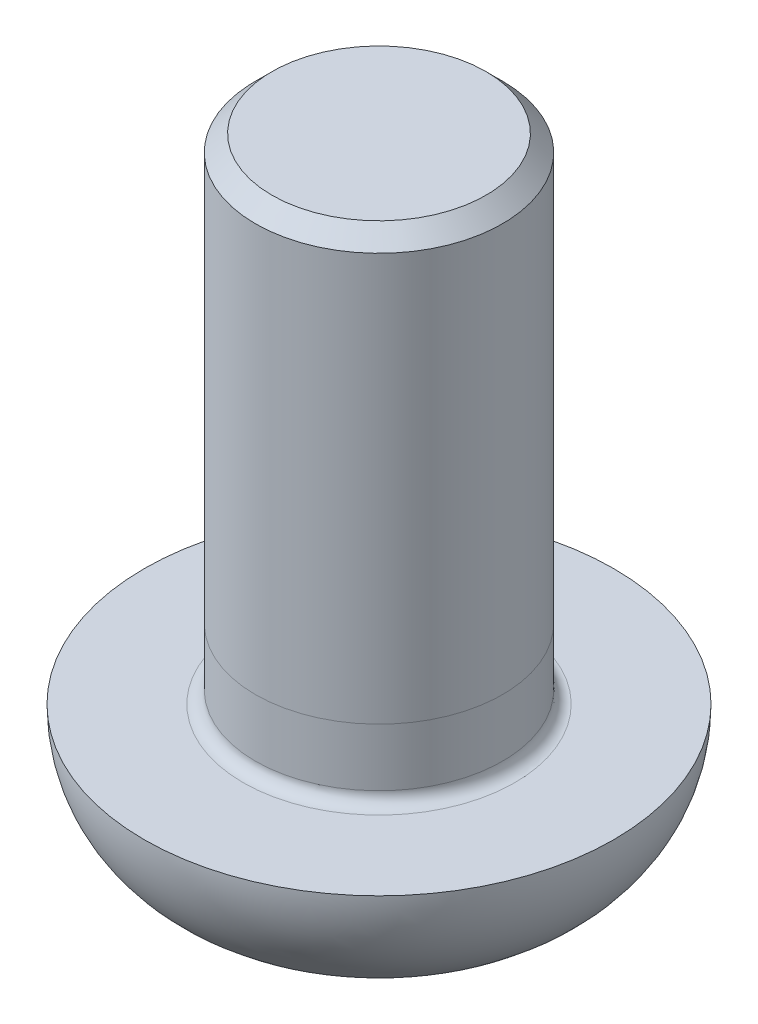
ISO-10303-21;
HEADER;
FILE_DESCRIPTION(('STEP AP214'),'2;1');
FILE_NAME('part.step','',(''),(''),'','','');
FILE_SCHEMA(('AUTOMOTIVE_DESIGN { 1 0 10303 214 1 1 1 1 }'));
ENDSEC;
DATA;
#1=APPLICATION_CONTEXT('core data for automotive mechanical design processes');
#2=APPLICATION_PROTOCOL_DEFINITION('international standard','automotive_design',2000,#1);
#3=PRODUCT_CONTEXT('',#1,'mechanical');
#4=PRODUCT('Part','Part','',(#3));
#5=PRODUCT_RELATED_PRODUCT_CATEGORY('part','',(#4));
#6=PRODUCT_DEFINITION_FORMATION('','',#4);
#7=PRODUCT_DEFINITION_CONTEXT('part definition',#1,'design');
#8=PRODUCT_DEFINITION('design','',#6,#7);
#9=PRODUCT_DEFINITION_SHAPE('','',#8);
#10=(LENGTH_UNIT() NAMED_UNIT(*) SI_UNIT(.MILLI.,.METRE.));
#11=(NAMED_UNIT(*) PLANE_ANGLE_UNIT() SI_UNIT($,.RADIAN.));
#12=(NAMED_UNIT(*) SI_UNIT($,.STERADIAN.) SOLID_ANGLE_UNIT());
#13=UNCERTAINTY_MEASURE_WITH_UNIT(LENGTH_MEASURE(1.E-05),#10,'distance_accuracy_value','');
#14=(GEOMETRIC_REPRESENTATION_CONTEXT(3) GLOBAL_UNCERTAINTY_ASSIGNED_CONTEXT((#13)) GLOBAL_UNIT_ASSIGNED_CONTEXT((#10,
#11,#12)) REPRESENTATION_CONTEXT('',''));
#15=CARTESIAN_POINT('',(0.,0.,0.));
#16=DIRECTION('',(0.,0.,1.));
#17=DIRECTION('',(1.,0.,0.));
#18=AXIS2_PLACEMENT_3D('',#15,#16,#17);
#19=CARTESIAN_POINT('',(0.,0.,0.));
#20=DIRECTION('',(0.,1.,0.));
#21=DIRECTION('',(0.,0.,1.));
#22=AXIS2_PLACEMENT_3D('',#19,#20,#21);
#23=CYLINDRICAL_SURFACE('',#22,2.);
#24=CARTESIAN_POINT('',(0.,7.73333333333333,0.));
#25=DIRECTION('',(0.,1.,0.));
#26=DIRECTION('',(0.,0.,1.));
#27=AXIS2_PLACEMENT_3D('',#24,#25,#26);
#28=CIRCLE('',#27,2.);
#29=CARTESIAN_POINT('',(0.,7.73333333333333,2.));
#30=VERTEX_POINT('',#29);
#31=EDGE_CURVE('E28',#30,#30,#28,.F.);
#32=ORIENTED_EDGE('',*,*,#31,.T.);
#33=EDGE_LOOP('',(#32));
#34=FACE_BOUND('',#33,.T.);
#35=CARTESIAN_POINT('',(0.,1.13333333333333,0.));
#36=DIRECTION('',(0.,1.,0.));
#37=DIRECTION('',(0.,0.,1.));
#38=AXIS2_PLACEMENT_3D('',#35,#36,#37);
#39=CIRCLE('',#38,2.);
#40=CARTESIAN_POINT('',(0.,1.13333333333333,2.));
#41=VERTEX_POINT('',#40);
#42=EDGE_CURVE('E11',#41,#41,#39,.T.);
#43=ORIENTED_EDGE('',*,*,#42,.T.);
#44=EDGE_LOOP('',(#43));
#45=FACE_BOUND('',#44,.T.);
#46=ADVANCED_FACE('F18',(#34,#45),#23,.T.);
#47=ORIENTED_EDGE('',*,*,#42,.F.);
#48=EDGE_LOOP('',(#47));
#49=FACE_BOUND('',#48,.T.);
#50=CARTESIAN_POINT('',(0.,0.2,0.));
#51=DIRECTION('',(0.,1.,0.));
#52=DIRECTION('',(0.,0.,1.));
#53=AXIS2_PLACEMENT_3D('',#50,#51,#52);
#54=CIRCLE('',#53,2.);
#55=CARTESIAN_POINT('',(0.,0.2,2.));
#56=VERTEX_POINT('',#55);
#57=EDGE_CURVE('E280',#56,#56,#54,.T.);
#58=ORIENTED_EDGE('',*,*,#57,.T.);
#59=EDGE_LOOP('',(#58));
#60=FACE_BOUND('',#59,.T.);
#61=ADVANCED_FACE('F192',(#49,#60),#23,.T.);
#62=CARTESIAN_POINT('',(3.8,0.,0.));
#63=DIRECTION('',(0.,1.,0.));
#64=DIRECTION('',(0.,0.,1.));
#65=AXIS2_PLACEMENT_3D('',#62,#63,#64);
#66=PLANE('',#65);
#67=CARTESIAN_POINT('',(0.,0.,0.));
#68=DIRECTION('',(0.,1.,0.));
#69=DIRECTION('',(0.,0.,1.));
#70=AXIS2_PLACEMENT_3D('',#67,#68,#69);
#71=CIRCLE('',#70,2.2);
#72=CARTESIAN_POINT('',(0.,0.,2.2));
#73=VERTEX_POINT('',#72);
#74=EDGE_CURVE('E277',#73,#73,#71,.F.);
#75=ORIENTED_EDGE('',*,*,#74,.T.);
#76=EDGE_LOOP('',(#75));
#77=FACE_BOUND('',#76,.T.);
#78=CARTESIAN_POINT('',(0.,0.,0.));
#79=DIRECTION('',(0.,1.,0.));
#80=DIRECTION('',(0.,0.,1.));
#81=AXIS2_PLACEMENT_3D('',#78,#79,#80);
#82=CIRCLE('',#81,3.8);
#83=CARTESIAN_POINT('',(0.,0.,3.8));
#84=VERTEX_POINT('',#83);
#85=EDGE_CURVE('E108',#84,#84,#82,.T.);
#86=ORIENTED_EDGE('',*,*,#85,.T.);
#87=EDGE_LOOP('',(#86));
#88=FACE_BOUND('',#87,.T.);
#89=ADVANCED_FACE('F199',(#77,#88),#66,.T.);
#90=CARTESIAN_POINT('',(0.,8.,0.));
#91=DIRECTION('',(0.,1.,0.));
#92=DIRECTION('',(0.,0.,1.));
#93=AXIS2_PLACEMENT_3D('',#90,#91,#92);
#94=PLANE('',#93);
#95=CARTESIAN_POINT('',(0.,8.,0.));
#96=DIRECTION('',(0.,1.,0.));
#97=DIRECTION('',(0.,0.,1.));
#98=AXIS2_PLACEMENT_3D('',#95,#96,#97);
#99=CIRCLE('',#98,1.73333333333333);
#100=CARTESIAN_POINT('',(0.,8.,1.73333333333333));
#101=VERTEX_POINT('',#100);
#102=EDGE_CURVE('E282',#101,#101,#99,.T.);
#103=ORIENTED_EDGE('',*,*,#102,.T.);
#104=EDGE_LOOP('',(#103));
#105=FACE_BOUND('',#104,.T.);
#106=ADVANCED_FACE('F227',(#105),#94,.T.);
#107=CARTESIAN_POINT('',(0.,0.2,0.));
#108=DIRECTION('',(0.,1.,0.));
#109=DIRECTION('',(0.,0.,1.));
#110=AXIS2_PLACEMENT_3D('',#107,#108,#109);
#111=TOROIDAL_SURFACE('',#110,2.2,0.2);
#112=ORIENTED_EDGE('',*,*,#74,.F.);
#113=EDGE_LOOP('',(#112));
#114=FACE_BOUND('',#113,.T.);
#115=ORIENTED_EDGE('',*,*,#57,.F.);
#116=EDGE_LOOP('',(#115));
#117=FACE_BOUND('',#116,.T.);
#118=ADVANCED_FACE('F265',(#114,#117),#111,.F.);
#119=CARTESIAN_POINT('',(0.,8.,0.));
#120=DIRECTION('',(0.,-1.,0.));
#121=DIRECTION('',(0.,0.,-1.));
#122=AXIS2_PLACEMENT_3D('',#119,#120,#121);
#123=CONICAL_SURFACE('',#122,1.73333333333333,0.785398163397448);
#124=ORIENTED_EDGE('',*,*,#31,.F.);
#125=EDGE_LOOP('',(#124));
#126=FACE_BOUND('',#125,.T.);
#127=ORIENTED_EDGE('',*,*,#102,.F.);
#128=EDGE_LOOP('',(#127));
#129=FACE_BOUND('',#128,.T.);
#130=ADVANCED_FACE('F21',(#126,#129),#123,.T.);
#131=CARTESIAN_POINT('',(0.,0.,0.));
#132=DIRECTION('',(0.,-1.,0.));
#133=DIRECTION('',(0.,0.,-1.));
#134=AXIS2_PLACEMENT_3D('',#131,#132,#133);
#135=DEGENERATE_TOROIDAL_SURFACE('',#134,1.57361997405967,2.22638002594034,.T.);
#136=ORIENTED_EDGE('',*,*,#85,.F.);
#137=EDGE_LOOP('',(#136));
#138=FACE_BOUND('',#137,.T.);
#139=CARTESIAN_POINT('',(0.,-2.2,0.));
#140=DIRECTION('',(0.,-1.,0.));
#141=DIRECTION('',(0.,0.,-1.));
#142=AXIS2_PLACEMENT_3D('',#139,#140,#141);
#143=CIRCLE('',#142,1.91533333333333);
#144=CARTESIAN_POINT('',(0.,-2.2,-1.91533333333333));
#145=VERTEX_POINT('',#144);
#146=EDGE_CURVE('E119',#145,#145,#143,.T.);
#147=ORIENTED_EDGE('',*,*,#146,.F.);
#148=EDGE_LOOP('',(#147));
#149=FACE_BOUND('',#148,.T.);
#150=ADVANCED_FACE('F143',(#138,#149),#135,.T.);
#151=CARTESIAN_POINT('',(0.,0.218038796285712,0.));
#152=DIRECTION('',(0.,-1.,0.));
#153=DIRECTION('',(0.,0.,-1.));
#154=AXIS2_PLACEMENT_3D('',#151,#152,#153);
#155=CONICAL_SURFACE('',#154,0.,1.0471975511966);
#156=CARTESIAN_POINT('',(0.,0.218038796285712,0.));
#157=VERTEX_POINT('',#156);
#158=VERTEX_LOOP('',#157);
#159=FACE_BOUND('',#158,.T.);
#160=CARTESIAN_POINT('',(-0.721572366433197,-0.61536121171365,1.2502));
#161=CARTESIAN_POINT('',(-0.753288124996233,-0.597040451811313,1.19526669476823));
#162=CARTESIAN_POINT('',(-0.785277649221706,-0.58037784324826,1.13985921349976));
#163=CARTESIAN_POINT('',(-0.849810733708406,-0.551291840993392,1.02808463239966));
#164=CARTESIAN_POINT('',(-0.882355441401185,-0.538878739023672,0.971715545158289));
#165=CARTESIAN_POINT('',(-0.947041487997321,-0.519554224683634,0.859676025913014));
#166=CARTESIAN_POINT('',(-0.979172868975897,-0.512514226495054,0.804022841540769));
#167=CARTESIAN_POINT('',(-1.04358696985655,-0.504106969678256,0.692454346091606));
#168=CARTESIAN_POINT('',(-1.07586945532687,-0.502732752252347,0.636539441062396));
#169=CARTESIAN_POINT('',(-1.13620103554813,-0.505577874415543,0.532042078818271));
#170=CARTESIAN_POINT('',(-1.16425912049992,-0.509098635867638,0.483444050118682));
#171=CARTESIAN_POINT('',(-1.2201924752656,-0.520261649746878,0.386564637826761));
#172=CARTESIAN_POINT('',(-1.24806755133608,-0.5279077226203,0.338283589807836));
#173=CARTESIAN_POINT('',(-1.30411641158755,-0.547023991748154,0.241204116145956));
#174=CARTESIAN_POINT('',(-1.33228309485381,-0.55857529402728,0.1924179896481));
#175=CARTESIAN_POINT('',(-1.38819614400745,-0.584792851741514,0.095573747707898));
#176=CARTESIAN_POINT('',(-1.41594322730596,-0.599452939186728,0.0475143896730359));
#177=CARTESIAN_POINT('',(-1.4434911430279,-0.615361211713649,-0.000200000000000275));
#178=B_SPLINE_CURVE_WITH_KNOTS('',3,(#160,#161,#162,#163,#164,#165,#166,#167,#168,#169,#170,
#171,#172,#173,#174,#175,#176,#177),.UNSPECIFIED.,.F.,.F.,(4,2,2,2,2,2,2,2,4),(0.,
0.19815082102956,0.396778196315222,0.590488617354402,0.783961049317185,0.952480056398648,
1.1211553973001,1.2935743034359,1.4656542697693),.UNSPECIFIED.);
#179=CARTESIAN_POINT('',(-0.721687836487035,-0.615294537047623,1.25));
#180=VERTEX_POINT('',#179);
#181=CARTESIAN_POINT('',(-1.44337567297406,-0.615294537047622,0.));
#182=VERTEX_POINT('',#181);
#183=EDGE_CURVE('E231',#180,#182,#178,.T.);
#184=ORIENTED_EDGE('',*,*,#183,.T.);
#185=CARTESIAN_POINT('',(-1.4434911430279,-0.615361211713649,0.000199999999999764));
#186=CARTESIAN_POINT('',(-1.41177538446487,-0.597040451811311,-0.0547333052317656));
#187=CARTESIAN_POINT('',(-1.37978586023939,-0.580377843248258,-0.11014078650024));
#188=CARTESIAN_POINT('',(-1.31525277575269,-0.55129184099339,-0.221915367600341));
#189=CARTESIAN_POINT('',(-1.28270806805991,-0.53887873902367,-0.278284454841711));
#190=CARTESIAN_POINT('',(-1.21802202146378,-0.519554224683632,-0.390323974086985));
#191=CARTESIAN_POINT('',(-1.1858906404852,-0.512514226495052,-0.44597715845923));
#192=CARTESIAN_POINT('',(-1.12147653960455,-0.504106969678254,-0.557545653908392));
#193=CARTESIAN_POINT('',(-1.08919405413422,-0.502732752252345,-0.6134605589376));
#194=CARTESIAN_POINT('',(-1.02886247391297,-0.505577874415541,-0.717957921181725));
#195=CARTESIAN_POINT('',(-1.00080438896118,-0.509098635867636,-0.766555949881316));
#196=CARTESIAN_POINT('',(-0.944871034195502,-0.520261649746876,-0.863435362173239));
#197=CARTESIAN_POINT('',(-0.916995958125019,-0.527907722620297,-0.911716410192164));
#198=CARTESIAN_POINT('',(-0.860947097873545,-0.547023991748152,-1.00879588385404));
#199=CARTESIAN_POINT('',(-0.832780414607288,-0.558575294027278,-1.0575820103519));
#200=CARTESIAN_POINT('',(-0.776867365453647,-0.584792851741513,-1.1544262522921));
#201=CARTESIAN_POINT('',(-0.749120282155139,-0.599452939186727,-1.20248561032696));
#202=CARTESIAN_POINT('',(-0.721572366433192,-0.615361211713649,-1.2502));
#203=B_SPLINE_CURVE_WITH_KNOTS('',3,(#185,#186,#187,#188,#189,#190,#191,#192,#193,#194,#195,
#196,#197,#198,#199,#200,#201,#202),.UNSPECIFIED.,.F.,.F.,(4,2,2,2,2,2,2,2,4),(0.,
0.19815082102956,0.396778196315221,0.5904886173544,0.783961049317182,0.952480056398646,
1.1211553973001,1.2935743034359,1.4656542697693),.UNSPECIFIED.);
#204=CARTESIAN_POINT('',(-0.72168783648703,-0.615294537047622,-1.25));
#205=VERTEX_POINT('',#204);
#206=EDGE_CURVE('E210',#182,#205,#203,.T.);
#207=ORIENTED_EDGE('',*,*,#206,.T.);
#208=CARTESIAN_POINT('',(-2.54763263884396,-1.42034781483543,-1.25));
#209=CARTESIAN_POINT('',(-2.48858814848979,-1.38974655627274,-1.25));
#210=CARTESIAN_POINT('',(-2.42946132380861,-1.35930325819372,-1.25));
#211=CARTESIAN_POINT('',(-2.31100621337497,-1.29880899854642,-1.25));
#212=CARTESIAN_POINT('',(-2.25167792439344,-1.26875804330437,-1.25));
#213=CARTESIAN_POINT('',(-2.07315573182142,-1.17921810874384,-1.25));
#214=CARTESIAN_POINT('',(-1.95360584248973,-1.120436634465,-1.25));
#215=CARTESIAN_POINT('',(-1.70660137514319,-1.00259349280083,-1.25));
#216=CARTESIAN_POINT('',(-1.57907012570324,-0.943690001440491,-1.25));
#217=CARTESIAN_POINT('',(-1.38607065799675,-0.859297157706683,-1.25));
#218=CARTESIAN_POINT('',(-1.32146942405589,-0.831832716991689,-1.25));
#219=CARTESIAN_POINT('',(-1.19155331450912,-0.778654559169664,-1.25));
#220=CARTESIAN_POINT('',(-1.12623850703849,-0.752940676577808,-1.25));
#221=CARTESIAN_POINT('',(-0.985406106106382,-0.700337108531101,-1.25));
#222=CARTESIAN_POINT('',(-0.909755708075264,-0.67379820711949,-1.25));
#223=CARTESIAN_POINT('',(-0.757125975582203,-0.62491472978331,-1.25));
#224=CARTESIAN_POINT('',(-0.680147301103551,-0.60256813282724,-1.25));
#225=CARTESIAN_POINT('',(-0.526245045804024,-0.563995858609741,-1.25));
#226=CARTESIAN_POINT('',(-0.449350335936646,-0.547658128160713,-1.25));
#227=CARTESIAN_POINT('',(-0.294381725409083,-0.522156855321589,-1.25));
#228=CARTESIAN_POINT('',(-0.216308559961843,-0.512989014208104,-1.25));
#229=CARTESIAN_POINT('',(-0.0583828758011715,-0.502995662912947,-1.25));
#230=CARTESIAN_POINT('',(0.0214784313803951,-0.502302121878524,-1.25));
#231=CARTESIAN_POINT('',(0.180791772460036,-0.509712504848663,-1.25));
#232=CARTESIAN_POINT('',(0.260243691894857,-0.517818767974262,-1.25));
#233=CARTESIAN_POINT('',(0.419601542701518,-0.541896181288127,-1.25));
#234=CARTESIAN_POINT('',(0.499482097120194,-0.558028587116615,-1.25));
#235=CARTESIAN_POINT('',(0.657747733098109,-0.596405359159968,-1.25));
#236=CARTESIAN_POINT('',(0.736132187697356,-0.618652230083401,-1.25));
#237=CARTESIAN_POINT('',(0.891742095151457,-0.667669145495548,-1.25));
#238=CARTESIAN_POINT('',(0.968962615121981,-0.694454533628736,-1.25));
#239=CARTESIAN_POINT('',(1.12222685935084,-0.751228876861405,-1.25));
#240=CARTESIAN_POINT('',(1.19827022427451,-0.781218788916174,-1.25));
#241=CARTESIAN_POINT('',(1.34949127522801,-0.843535866441461,-1.25));
#242=CARTESIAN_POINT('',(1.42466781555005,-0.87586578779028,-1.25));
#243=CARTESIAN_POINT('',(1.57427404296598,-0.942212209554762,-1.24999999999999));
#244=CARTESIAN_POINT('',(1.64870368385957,-0.976228813538264,-1.24999999999999));
#245=CARTESIAN_POINT('',(1.79249475511652,-1.04342426579454,-1.24999999999999));
#246=CARTESIAN_POINT('',(1.86189070514544,-1.07652955895538,-1.24999999999999));
#247=CARTESIAN_POINT('',(2.00026915039475,-1.14359808337372,-1.24999999999999));
#248=CARTESIAN_POINT('',(2.06925162955222,-1.17756134769862,-1.24999999999999));
#249=CARTESIAN_POINT('',(2.20662390252237,-1.24602954716207,-1.24999999999999));
#250=CARTESIAN_POINT('',(2.27501494862433,-1.2805319756901,-1.24999999999999));
#251=CARTESIAN_POINT('',(2.41151727555281,-1.35007073700256,-1.24999999999999));
#252=CARTESIAN_POINT('',(2.47962858177214,-1.38510701990394,-1.25));
#253=CARTESIAN_POINT('',(2.54763263884396,-1.42034781483543,-1.25));
#254=B_SPLINE_CURVE_WITH_KNOTS('',3,(#208,#209,#210,#211,#212,#213,#214,#215,#216,#217,#218,
#219,#220,#221,#222,#223,#224,#225,#226,#227,#228,#229,#230,#231,#232,#233,#234,#235,#236,#237,
#238,#239,#240,#241,#242,#243,#244,#245,#246,#247,#248,#249,#250,#251,#252,#253),.UNSPECIFIED.,
.F.,.F.,(4,2,2,2,2,2,2,2,2,2,2,2,2,2,2,2,2,2,2,2,2,2,4),(0.,0.199510194000779,0.399023600987611,
0.798663907516947,1.22000952232658,1.43058141360586,1.64113337125418,1.88155803417432,
2.12186649334229,2.35743429194047,2.59286074682579,2.83194887701048,3.07110057600163,
3.3152639050817,3.55952740184668,3.80463380271368,4.04981360446127,4.29528701151662,
4.5407755101542,4.77143218626564,5.00209776580819,5.23189900507726,5.46167890194615),.UNSPECIFIED.);
#255=CARTESIAN_POINT('',(0.721687836487034,-0.615294537047622,-1.25));
#256=VERTEX_POINT('',#255);
#257=EDGE_CURVE('E106',#205,#256,#254,.T.);
#258=ORIENTED_EDGE('',*,*,#257,.T.);
#259=CARTESIAN_POINT('',(0.721572366433196,-0.615361211713648,-1.2502));
#260=CARTESIAN_POINT('',(0.753288124996232,-0.597040451811311,-1.19526669476824));
#261=CARTESIAN_POINT('',(0.785277649221705,-0.580377843248258,-1.13985921349976));
#262=CARTESIAN_POINT('',(0.849810733708405,-0.551291840993391,-1.02808463239966));
#263=CARTESIAN_POINT('',(0.882355441401183,-0.538878739023671,-0.971715545158289));
#264=CARTESIAN_POINT('',(0.947041487997319,-0.519554224683633,-0.859676025913015));
#265=CARTESIAN_POINT('',(0.979172868975896,-0.512514226495053,-0.804022841540771));
#266=CARTESIAN_POINT('',(1.04358696985655,-0.504106969678255,-0.692454346091608));
#267=CARTESIAN_POINT('',(1.07586945532687,-0.502732752252346,-0.636539441062398));
#268=CARTESIAN_POINT('',(1.13620103554812,-0.505577874415542,-0.532042078818273));
#269=CARTESIAN_POINT('',(1.16425912049992,-0.509098635867637,-0.483444050118684));
#270=CARTESIAN_POINT('',(1.2201924752656,-0.520261649746878,-0.386564637826762));
#271=CARTESIAN_POINT('',(1.24806755133608,-0.527907722620299,-0.338283589807837));
#272=CARTESIAN_POINT('',(1.30411641158755,-0.547023991748154,-0.241204116145957));
#273=CARTESIAN_POINT('',(1.33228309485381,-0.55857529402728,-0.192417989648101));
#274=CARTESIAN_POINT('',(1.38819614400745,-0.584792851741514,-0.0955737477078978));
#275=CARTESIAN_POINT('',(1.41594322730596,-0.599452939186728,-0.0475143896730351));
#276=CARTESIAN_POINT('',(1.4434911430279,-0.615361211713649,0.000200000000002222));
#277=B_SPLINE_CURVE_WITH_KNOTS('',3,(#259,#260,#261,#262,#263,#264,#265,#266,#267,#268,#269,
#270,#271,#272,#273,#274,#275,#276),.UNSPECIFIED.,.F.,.F.,(4,2,2,2,2,2,2,2,4),(0.,
0.19815082102956,0.396778196315221,0.5904886173544,0.783961049317182,0.952480056398646,
1.1211553973001,1.2935743034359,1.4656542697693),.UNSPECIFIED.);
#278=CARTESIAN_POINT('',(1.44337567297406,-0.615294537047623,0.));
#279=VERTEX_POINT('',#278);
#280=EDGE_CURVE('E255',#256,#279,#277,.T.);
#281=ORIENTED_EDGE('',*,*,#280,.T.);
#282=CARTESIAN_POINT('',(1.4434911430279,-0.615361211713649,-0.000199999999997595));
#283=CARTESIAN_POINT('',(1.41177538446487,-0.597040451811311,0.0547333052317679));
#284=CARTESIAN_POINT('',(1.37978586023939,-0.580377843248258,0.110140786500242));
#285=CARTESIAN_POINT('',(1.31525277575269,-0.551291840993391,0.221915367600343));
#286=CARTESIAN_POINT('',(1.28270806805991,-0.538878739023671,0.278284454841713));
#287=CARTESIAN_POINT('',(1.21802202146378,-0.519554224683633,0.390323974086987));
#288=CARTESIAN_POINT('',(1.1858906404852,-0.512514226495053,0.445977158459233));
#289=CARTESIAN_POINT('',(1.12147653960455,-0.504106969678255,0.557545653908394));
#290=CARTESIAN_POINT('',(1.08919405413422,-0.502732752252346,0.613460558937601));
#291=CARTESIAN_POINT('',(1.02886247391297,-0.505577874415542,0.717957921181726));
#292=CARTESIAN_POINT('',(1.00080438896118,-0.509098635867638,0.766555949881317));
#293=CARTESIAN_POINT('',(0.944871034195502,-0.520261649746878,0.863435362173241));
#294=CARTESIAN_POINT('',(0.916995958125018,-0.527907722620299,0.911716410192165));
#295=CARTESIAN_POINT('',(0.860947097873545,-0.547023991748154,1.00879588385404));
#296=CARTESIAN_POINT('',(0.832780414607288,-0.55857529402728,1.0575820103519));
#297=CARTESIAN_POINT('',(0.776867365453647,-0.584792851741514,1.1544262522921));
#298=CARTESIAN_POINT('',(0.749120282155137,-0.599452939186728,1.20248561032697));
#299=CARTESIAN_POINT('',(0.721572366433189,-0.615361211713649,1.2502));
#300=B_SPLINE_CURVE_WITH_KNOTS('',3,(#282,#283,#284,#285,#286,#287,#288,#289,#290,#291,#292,
#293,#294,#295,#296,#297,#298,#299),.UNSPECIFIED.,.F.,.F.,(4,2,2,2,2,2,2,2,4),(0.,
0.198150821029559,0.396778196315221,0.5904886173544,0.783961049317182,0.952480056398646,
1.1211553973001,1.2935743034359,1.4656542697693),.UNSPECIFIED.);
#301=CARTESIAN_POINT('',(0.721687836487027,-0.615294537047623,1.25));
#302=VERTEX_POINT('',#301);
#303=EDGE_CURVE('E249',#279,#302,#300,.T.);
#304=ORIENTED_EDGE('',*,*,#303,.T.);
#305=CARTESIAN_POINT('',(2.54763263884395,-1.42034781483543,1.25));
#306=CARTESIAN_POINT('',(2.48858814848978,-1.38974655627274,1.25));
#307=CARTESIAN_POINT('',(2.42946132380861,-1.35930325819372,1.25));
#308=CARTESIAN_POINT('',(2.31100621337497,-1.29880899854642,1.25));
#309=CARTESIAN_POINT('',(2.25167792439344,-1.26875804330437,1.25));
#310=CARTESIAN_POINT('',(2.07315573182142,-1.17921810874384,1.25));
#311=CARTESIAN_POINT('',(1.95360584248973,-1.120436634465,1.25));
#312=CARTESIAN_POINT('',(1.70660137514319,-1.00259349280083,1.25));
#313=CARTESIAN_POINT('',(1.57907012570324,-0.94369000144049,1.25));
#314=CARTESIAN_POINT('',(1.38607065799675,-0.859297157706682,1.25));
#315=CARTESIAN_POINT('',(1.32146942405588,-0.831832716991688,1.25));
#316=CARTESIAN_POINT('',(1.19155331450912,-0.778654559169664,1.25));
#317=CARTESIAN_POINT('',(1.12623850703849,-0.752940676577808,1.25));
#318=CARTESIAN_POINT('',(0.985406106106378,-0.700337108531101,1.25));
#319=CARTESIAN_POINT('',(0.90975570807526,-0.67379820711949,1.25));
#320=CARTESIAN_POINT('',(0.757125975582199,-0.62491472978331,1.25));
#321=CARTESIAN_POINT('',(0.680147301103546,-0.60256813282724,1.25));
#322=CARTESIAN_POINT('',(0.526245045804019,-0.563995858609741,1.25));
#323=CARTESIAN_POINT('',(0.449350335936641,-0.547658128160713,1.25));
#324=CARTESIAN_POINT('',(0.294381725409078,-0.52215685532159,1.25));
#325=CARTESIAN_POINT('',(0.216308559961838,-0.512989014208105,1.25));
#326=CARTESIAN_POINT('',(0.0583828758011658,-0.502995662912949,1.25));
#327=CARTESIAN_POINT('',(-0.021478431380401,-0.502302121878525,1.25));
#328=CARTESIAN_POINT('',(-0.180791772460042,-0.509712504848665,1.25));
#329=CARTESIAN_POINT('',(-0.260243691894863,-0.517818767974264,1.25));
#330=CARTESIAN_POINT('',(-0.419601542701524,-0.54189618128813,1.25));
#331=CARTESIAN_POINT('',(-0.4994820971202,-0.558028587116618,1.25));
#332=CARTESIAN_POINT('',(-0.657747733098115,-0.596405359159971,1.25));
#333=CARTESIAN_POINT('',(-0.736132187697362,-0.618652230083405,1.25));
#334=CARTESIAN_POINT('',(-0.891742095151464,-0.667669145495552,1.25));
#335=CARTESIAN_POINT('',(-0.968962615121988,-0.694454533628739,1.25));
#336=CARTESIAN_POINT('',(-1.12222685935085,-0.751228876861408,1.25));
#337=CARTESIAN_POINT('',(-1.19827022427451,-0.781218788916176,1.25));
#338=CARTESIAN_POINT('',(-1.34949127522802,-0.843535866441464,1.25));
#339=CARTESIAN_POINT('',(-1.42466781555005,-0.875865787790282,1.25));
#340=CARTESIAN_POINT('',(-1.57427404296599,-0.942212209554764,1.24999999999999));
#341=CARTESIAN_POINT('',(-1.64870368385958,-0.976228813538266,1.24999999999999));
#342=CARTESIAN_POINT('',(-1.79249475511652,-1.04342426579454,1.24999999999999));
#343=CARTESIAN_POINT('',(-1.86189070514545,-1.07652955895538,1.24999999999999));
#344=CARTESIAN_POINT('',(-2.00026915039475,-1.14359808337372,1.24999999999999));
#345=CARTESIAN_POINT('',(-2.06925162955222,-1.17756134769862,1.24999999999999));
#346=CARTESIAN_POINT('',(-2.20662390252237,-1.24602954716207,1.24999999999999));
#347=CARTESIAN_POINT('',(-2.27501494862433,-1.2805319756901,1.24999999999999));
#348=CARTESIAN_POINT('',(-2.41151727555281,-1.35007073700256,1.24999999999999));
#349=CARTESIAN_POINT('',(-2.47962858177214,-1.38510701990394,1.25));
#350=CARTESIAN_POINT('',(-2.54763263884396,-1.42034781483543,1.25));
#351=B_SPLINE_CURVE_WITH_KNOTS('',3,(#305,#306,#307,#308,#309,#310,#311,#312,#313,#314,#315,
#316,#317,#318,#319,#320,#321,#322,#323,#324,#325,#326,#327,#328,#329,#330,#331,#332,#333,#334,
#335,#336,#337,#338,#339,#340,#341,#342,#343,#344,#345,#346,#347,#348,#349,#350),.UNSPECIFIED.,
.F.,.F.,(4,2,2,2,2,2,2,2,2,2,2,2,2,2,2,2,2,2,2,2,2,2,4),(0.,0.19951019400078,0.399023600987611,
0.798663907516946,1.22000952232658,1.43058141360585,1.64113337125418,1.88155803417432,
2.12186649334229,2.35743429194047,2.59286074682579,2.83194887701048,3.07110057600163,
3.3152639050817,3.55952740184668,3.80463380271368,4.04981360446127,4.29528701151662,
4.5407755101542,4.77143218626563,5.00209776580819,5.23189900507725,5.46167890194614),.UNSPECIFIED.);
#352=EDGE_CURVE('E241',#302,#180,#351,.T.);
#353=ORIENTED_EDGE('',*,*,#352,.T.);
#354=EDGE_LOOP('',(#184,#207,#258,#281,#304,#353));
#355=FACE_BOUND('',#354,.T.);
#356=ADVANCED_FACE('F176',(#159,#355),#155,.F.);
#357=CARTESIAN_POINT('',(-0.72168783648703,12.6175571535932,-1.25));
#358=DIRECTION('',(0.,0.,-1.));
#359=DIRECTION('',(-1.,0.,0.));
#360=AXIS2_PLACEMENT_3D('',#357,#358,#359);
#361=PLANE('',#360);
#362=CARTESIAN_POINT('',(2.21618029010045,-2.49501772196151,-1.25));
#363=CARTESIAN_POINT('',(2.10936606191481,-2.47012332401513,-1.25));
#364=CARTESIAN_POINT('',(2.00246488821628,-2.44557841217469,-1.24999999999999));
#365=CARTESIAN_POINT('',(1.78837821052287,-2.39767058279579,-1.24999999999999));
#366=CARTESIAN_POINT('',(1.6811926576485,-2.37430788446022,-1.24999999999999));
#367=CARTESIAN_POINT('',(1.46542158435438,-2.32903790022172,-1.25));
#368=CARTESIAN_POINT('',(1.35683258951741,-2.30714698646027,-1.25));
#369=CARTESIAN_POINT('',(1.13914880335417,-2.26593268229671,-1.25));
#370=CARTESIAN_POINT('',(1.03005396350456,-2.24660954371237,-1.25));
#371=CARTESIAN_POINT('',(0.814238896808497,-2.21231796691772,-1.25));
#372=CARTESIAN_POINT('',(0.707535844178947,-2.19724441199983,-1.25));
#373=CARTESIAN_POINT('',(0.493517084290806,-2.17242089124017,-1.25));
#374=CARTESIAN_POINT('',(0.386201585888872,-2.16266920872266,-1.25));
#375=CARTESIAN_POINT('',(0.171630187154079,-2.15017436574306,-1.25));
#376=CARTESIAN_POINT('',(0.0643762684687093,-2.14739928448755,-1.25));
#377=CARTESIAN_POINT('',(-0.150067450726786,-2.14936439811048,-1.25));
#378=CARTESIAN_POINT('',(-0.257257246221635,-2.15410511921043,-1.25));
#379=CARTESIAN_POINT('',(-0.441548710693271,-2.16790329890964,-1.25));
#380=CARTESIAN_POINT('',(-0.51877636210218,-2.17540510134315,-1.25));
#381=CARTESIAN_POINT('',(-0.672906001333046,-2.1931763634565,-1.25));
#382=CARTESIAN_POINT('',(-0.749807997064919,-2.20344575551759,-1.25));
#383=CARTESIAN_POINT('',(-0.903544132095043,-2.22616520217257,-1.25));
#384=CARTESIAN_POINT('',(-0.980377195876617,-2.23862239282036,-1.25));
#385=CARTESIAN_POINT('',(-1.13376313938132,-2.26516157802732,-1.25));
#386=CARTESIAN_POINT('',(-1.21031600435658,-2.27924365687663,-1.25));
#387=CARTESIAN_POINT('',(-1.36480056304956,-2.30893461660055,-1.25));
#388=CARTESIAN_POINT('',(-1.44272722492156,-2.32456946515816,-1.25));
#389=CARTESIAN_POINT('',(-1.59838383904838,-2.35678893948095,-1.25));
#390=CARTESIAN_POINT('',(-1.67611378886618,-2.37337357695323,-1.25));
#391=CARTESIAN_POINT('',(-1.83097242167592,-2.4071623855122,-1.25));
#392=CARTESIAN_POINT('',(-1.90810200060965,-2.42436246994916,-1.25));
#393=CARTESIAN_POINT('',(-2.06223034987339,-2.45931461370083,-1.25));
#394=CARTESIAN_POINT('',(-2.13922912921443,-2.47706663321826,-1.25));
#395=CARTESIAN_POINT('',(-2.21618029010045,-2.4950177219615,-1.25));
#396=B_SPLINE_CURVE_WITH_KNOTS('',3,(#362,#363,#364,#365,#366,#367,#368,#369,#370,#371,#372,
#373,#374,#375,#376,#377,#378,#379,#380,#381,#382,#383,#384,#385,#386,#387,#388,#389,#390,#391,
#392,#393,#394,#395),.UNSPECIFIED.,.F.,.F.,(4,2,2,2,2,2,2,2,2,2,2,2,2,2,2,2,4),(0.,
0.329038094934357,0.658136977348986,0.990437847864555,1.32277128260328,1.64596801399935,
1.96906043015131,2.29067185412912,2.61230579683703,2.84502466849467,3.07773785479701,
3.3112246896656,3.54472364198108,3.78315484320089,4.02158898396091,4.2586591946207,
4.49571235079214),.UNSPECIFIED.);
#397=CARTESIAN_POINT('',(0.721687836487028,-2.2,-1.25));
#398=VERTEX_POINT('',#397);
#399=CARTESIAN_POINT('',(-0.721687836487033,-2.2,-1.25));
#400=VERTEX_POINT('',#399);
#401=EDGE_CURVE('E87',#398,#400,#396,.T.);
#402=ORIENTED_EDGE('',*,*,#401,.F.);
#403=DIRECTION('',(0.,-1.,0.));
#404=VECTOR('',#403,1.);
#405=CARTESIAN_POINT('',(0.721687836487034,12.6175571535932,-1.25));
#406=LINE('',#405,#404);
#407=EDGE_CURVE('E109',#256,#398,#406,.T.);
#408=ORIENTED_EDGE('',*,*,#407,.F.);
#409=ORIENTED_EDGE('',*,*,#257,.F.);
#410=DIRECTION('',(0.,-1.,0.));
#411=VECTOR('',#410,1.);
#412=CARTESIAN_POINT('',(-0.72168783648703,12.6175571535932,-1.25));
#413=LINE('',#412,#411);
#414=EDGE_CURVE('E99',#205,#400,#413,.T.);
#415=ORIENTED_EDGE('',*,*,#414,.T.);
#416=EDGE_LOOP('',(#402,#408,#409,#415));
#417=FACE_BOUND('',#416,.T.);
#418=ADVANCED_FACE('F104',(#417),#361,.F.);
#419=CARTESIAN_POINT('',(0.721687836487034,12.6175571535932,-1.25));
#420=DIRECTION('',(0.866025403784439,0.,-0.5));
#421=DIRECTION('',(-0.5,0.,-0.866025403784439));
#422=AXIS2_PLACEMENT_3D('',#419,#420,#421);
#423=PLANE('',#422);
#424=CARTESIAN_POINT('',(1.4434911430279,-2.2000309438202,0.000200000000002385));
#425=CARTESIAN_POINT('',(1.41351170712578,-2.19199301621074,-0.0517259061647353));
#426=CARTESIAN_POINT('',(1.38347789981082,-2.18469578948746,-0.103745986378985));
#427=CARTESIAN_POINT('',(1.32330417416086,-2.1718751075548,-0.207969936485411));
#428=CARTESIAN_POINT('',(1.29316421770585,-2.16635237347309,-0.260173872403407));
#429=CARTESIAN_POINT('',(1.23296101201229,-2.15740321415089,-0.36444888344318));
#430=CARTESIAN_POINT('',(1.20289817023859,-2.15396611222084,-0.416519252815131));
#431=CARTESIAN_POINT('',(1.1427341315148,-2.1493572967932,-0.520726424673275));
#432=CARTESIAN_POINT('',(1.11263294312267,-2.14818514459078,-0.572863212336638));
#433=CARTESIAN_POINT('',(1.05243056633843,-2.14818514459078,-0.677136787663362));
#434=CARTESIAN_POINT('',(1.0223293779463,-2.1493572967932,-0.729273575326725));
#435=CARTESIAN_POINT('',(0.962165339222511,-2.15396611222084,-0.833480747184869));
#436=CARTESIAN_POINT('',(0.932102497448812,-2.15740321415089,-0.88555111655682));
#437=CARTESIAN_POINT('',(0.871899291755248,-2.16635237347309,-0.989826127596593));
#438=CARTESIAN_POINT('',(0.841759335300236,-2.1718751075548,-1.04203006351459));
#439=CARTESIAN_POINT('',(0.781585609650284,-2.18469578948746,-1.14625401362101));
#440=CARTESIAN_POINT('',(0.751551802335322,-2.19199301621074,-1.19827409383526));
#441=CARTESIAN_POINT('',(0.721572366433196,-2.2000309438202,-1.2502));
#442=B_SPLINE_CURVE_WITH_KNOTS('',3,(#424,#425,#426,#427,#428,#429,#430,#431,#432,#433,#434,
#435,#436,#437,#438,#439,#440,#441),.UNSPECIFIED.,.F.,.F.,(4,2,2,2,2,2,2,2,4),(0.,
0.18149525192516,0.363064167833313,0.543695584294991,0.724292010212746,0.9048884361305,
1.08551985259218,1.26708876850033,1.44858402042549),.UNSPECIFIED.);
#443=CARTESIAN_POINT('',(1.44337567297407,-2.2,0.));
#444=VERTEX_POINT('',#443);
#445=EDGE_CURVE('E94',#444,#398,#442,.T.);
#446=ORIENTED_EDGE('',*,*,#445,.F.);
#447=DIRECTION('',(0.,-1.,0.));
#448=VECTOR('',#447,1.);
#449=CARTESIAN_POINT('',(1.44337567297406,12.6175571535932,0.));
#450=LINE('',#449,#448);
#451=EDGE_CURVE('E313',#279,#444,#450,.T.);
#452=ORIENTED_EDGE('',*,*,#451,.F.);
#453=ORIENTED_EDGE('',*,*,#280,.F.);
#454=ORIENTED_EDGE('',*,*,#407,.T.);
#455=EDGE_LOOP('',(#446,#452,#453,#454));
#456=FACE_BOUND('',#455,.T.);
#457=ADVANCED_FACE('F175',(#456),#423,.F.);
#458=CARTESIAN_POINT('',(1.44337567297406,12.6175571535932,0.));
#459=DIRECTION('',(0.866025403784437,0.,0.5));
#460=DIRECTION('',(0.5,0.,-0.866025403784437));
#461=AXIS2_PLACEMENT_3D('',#458,#459,#460);
#462=PLANE('',#461);
#463=CARTESIAN_POINT('',(0.721572366433189,-2.2000309438202,1.2502));
#464=CARTESIAN_POINT('',(0.751551802335317,-2.19199301621074,1.19827409383527));
#465=CARTESIAN_POINT('',(0.78158560965028,-2.18469578948746,1.14625401362102));
#466=CARTESIAN_POINT('',(0.841759335300232,-2.1718751075548,1.04203006351459));
#467=CARTESIAN_POINT('',(0.871899291755245,-2.16635237347309,0.989826127596595));
#468=CARTESIAN_POINT('',(0.932102497448809,-2.15740321415089,0.885551116556822));
#469=CARTESIAN_POINT('',(0.962165339222508,-2.15396611222084,0.833480747184872));
#470=CARTESIAN_POINT('',(1.0223293779463,-2.1493572967932,0.729273575326727));
#471=CARTESIAN_POINT('',(1.05243056633842,-2.14818514459078,0.677136787663365));
#472=CARTESIAN_POINT('',(1.11263294312267,-2.14818514459078,0.57286321233664));
#473=CARTESIAN_POINT('',(1.1427341315148,-2.1493572967932,0.520726424673278));
#474=CARTESIAN_POINT('',(1.20289817023859,-2.15396611222084,0.416519252815133));
#475=CARTESIAN_POINT('',(1.23296101201228,-2.15740321415089,0.364448883443183));
#476=CARTESIAN_POINT('',(1.29316421770585,-2.16635237347309,0.26017387240341));
#477=CARTESIAN_POINT('',(1.32330417416086,-2.1718751075548,0.207969936485414));
#478=CARTESIAN_POINT('',(1.38347789981081,-2.18469578948746,0.103745986378988));
#479=CARTESIAN_POINT('',(1.41351170712578,-2.19199301621074,0.0517259061647392));
#480=CARTESIAN_POINT('',(1.4434911430279,-2.2000309438202,-0.000199999999997409));
#481=B_SPLINE_CURVE_WITH_KNOTS('',3,(#463,#464,#465,#466,#467,#468,#469,#470,#471,#472,#473,
#474,#475,#476,#477,#478,#479,#480),.UNSPECIFIED.,.F.,.F.,(4,2,2,2,2,2,2,2,4),(0.,
0.181495251925161,0.363064167833313,0.543695584294991,0.724292010212745,0.904888436130499,
1.08551985259218,1.26708876850033,1.44858402042549),.UNSPECIFIED.);
#482=CARTESIAN_POINT('',(0.721687836487039,-2.2,1.25));
#483=VERTEX_POINT('',#482);
#484=EDGE_CURVE('E128',#483,#444,#481,.T.);
#485=ORIENTED_EDGE('',*,*,#484,.F.);
#486=DIRECTION('',(0.,-1.,0.));
#487=VECTOR('',#486,1.);
#488=CARTESIAN_POINT('',(0.721687836487027,12.6175571535932,1.25));
#489=LINE('',#488,#487);
#490=EDGE_CURVE('E310',#302,#483,#489,.T.);
#491=ORIENTED_EDGE('',*,*,#490,.F.);
#492=ORIENTED_EDGE('',*,*,#303,.F.);
#493=ORIENTED_EDGE('',*,*,#451,.T.);
#494=EDGE_LOOP('',(#485,#491,#492,#493));
#495=FACE_BOUND('',#494,.T.);
#496=ADVANCED_FACE('F179',(#495),#462,.F.);
#497=CARTESIAN_POINT('',(0.721687836487027,12.6175571535932,1.25));
#498=DIRECTION('',(0.,0.,1.));
#499=DIRECTION('',(1.,0.,0.));
#500=AXIS2_PLACEMENT_3D('',#497,#498,#499);
#501=PLANE('',#500);
#502=CARTESIAN_POINT('',(-2.21618029010045,-2.4950177219615,1.25));
#503=CARTESIAN_POINT('',(-2.10936606191481,-2.47012332401513,1.25));
#504=CARTESIAN_POINT('',(-2.00246488821628,-2.44557841217468,1.24999999999999));
#505=CARTESIAN_POINT('',(-1.78837821052287,-2.39767058279579,1.24999999999999));
#506=CARTESIAN_POINT('',(-1.6811926576485,-2.37430788446021,1.24999999999999));
#507=CARTESIAN_POINT('',(-1.46542158435437,-2.32903790022171,1.25));
#508=CARTESIAN_POINT('',(-1.35683258951741,-2.30714698646026,1.25));
#509=CARTESIAN_POINT('',(-1.13914880335416,-2.26593268229671,1.25));
#510=CARTESIAN_POINT('',(-1.03005396350456,-2.24660954371236,1.25));
#511=CARTESIAN_POINT('',(-0.814238896808492,-2.21231796691772,1.25));
#512=CARTESIAN_POINT('',(-0.707535844178942,-2.19724441199983,1.25));
#513=CARTESIAN_POINT('',(-0.493517084290801,-2.17242089124016,1.25));
#514=CARTESIAN_POINT('',(-0.386201585888867,-2.16266920872266,1.25));
#515=CARTESIAN_POINT('',(-0.171630187154073,-2.15017436574305,1.25));
#516=CARTESIAN_POINT('',(-0.0643762684687032,-2.14739928448755,1.25));
#517=CARTESIAN_POINT('',(0.150067450726792,-2.14936439811048,1.25));
#518=CARTESIAN_POINT('',(0.257257246221641,-2.15410511921043,1.25));
#519=CARTESIAN_POINT('',(0.441548710693277,-2.16790329890964,1.25));
#520=CARTESIAN_POINT('',(0.518776362102185,-2.17540510134316,1.25));
#521=CARTESIAN_POINT('',(0.67290600133305,-2.1931763634565,1.25));
#522=CARTESIAN_POINT('',(0.749807997064923,-2.20344575551759,1.25));
#523=CARTESIAN_POINT('',(0.903544132095046,-2.22616520217258,1.25));
#524=CARTESIAN_POINT('',(0.980377195876619,-2.23862239282037,1.25));
#525=CARTESIAN_POINT('',(1.13376313938132,-2.26516157802732,1.25));
#526=CARTESIAN_POINT('',(1.21031600435658,-2.27924365687664,1.25));
#527=CARTESIAN_POINT('',(1.36480056304956,-2.30893461660055,1.25));
#528=CARTESIAN_POINT('',(1.44272722492156,-2.32456946515817,1.25));
#529=CARTESIAN_POINT('',(1.59838383904838,-2.35678893948095,1.25));
#530=CARTESIAN_POINT('',(1.67611378886618,-2.37337357695323,1.25));
#531=CARTESIAN_POINT('',(1.83097242167592,-2.40716238551221,1.25));
#532=CARTESIAN_POINT('',(1.90810200060965,-2.42436246994917,1.25));
#533=CARTESIAN_POINT('',(2.06223034987339,-2.45931461370084,1.25));
#534=CARTESIAN_POINT('',(2.13922912921442,-2.47706663321826,1.25));
#535=CARTESIAN_POINT('',(2.21618029010045,-2.4950177219615,1.25));
#536=B_SPLINE_CURVE_WITH_KNOTS('',3,(#502,#503,#504,#505,#506,#507,#508,#509,#510,#511,#512,
#513,#514,#515,#516,#517,#518,#519,#520,#521,#522,#523,#524,#525,#526,#527,#528,#529,#530,#531,
#532,#533,#534,#535),.UNSPECIFIED.,.F.,.F.,(4,2,2,2,2,2,2,2,2,2,2,2,2,2,2,2,4),(0.,
0.329038094934358,0.658136977348987,0.990437847864556,1.32277128260328,1.64596801399936,
1.96906043015131,2.29067185412913,2.61230579683703,2.84502466849468,3.07773785479701,
3.3112246896656,3.54472364198108,3.78315484320089,4.0215889839609,4.2586591946207,
4.49571235079214),.UNSPECIFIED.);
#537=CARTESIAN_POINT('',(-0.721687836487035,-2.2,1.25));
#538=VERTEX_POINT('',#537);
#539=EDGE_CURVE('E81',#538,#483,#536,.T.);
#540=ORIENTED_EDGE('',*,*,#539,.F.);
#541=DIRECTION('',(0.,-1.,0.));
#542=VECTOR('',#541,1.);
#543=CARTESIAN_POINT('',(-0.721687836487035,12.6175571535932,1.25));
#544=LINE('',#543,#542);
#545=EDGE_CURVE('E42',#180,#538,#544,.T.);
#546=ORIENTED_EDGE('',*,*,#545,.F.);
#547=ORIENTED_EDGE('',*,*,#352,.F.);
#548=ORIENTED_EDGE('',*,*,#490,.T.);
#549=EDGE_LOOP('',(#540,#546,#547,#548));
#550=FACE_BOUND('',#549,.T.);
#551=ADVANCED_FACE('F135',(#550),#501,.F.);
#552=CARTESIAN_POINT('',(-0.721687836487035,12.6175571535932,1.25));
#553=DIRECTION('',(-0.86602540378444,0.,0.5));
#554=DIRECTION('',(0.5,0.,0.86602540378444));
#555=AXIS2_PLACEMENT_3D('',#552,#553,#554);
#556=PLANE('',#555);
#557=CARTESIAN_POINT('',(-1.4434911430279,-2.20003094382019,-0.000200000000000267));
#558=CARTESIAN_POINT('',(-1.41351170712578,-2.19199301621073,0.0517259061647366));
#559=CARTESIAN_POINT('',(-1.38347789981082,-2.18469578948745,0.103745986378986));
#560=CARTESIAN_POINT('',(-1.32330417416086,-2.17187510755479,0.207969936485412));
#561=CARTESIAN_POINT('',(-1.29316421770585,-2.16635237347309,0.260173872403408));
#562=CARTESIAN_POINT('',(-1.23296101201229,-2.15740321415089,0.36444888344318));
#563=CARTESIAN_POINT('',(-1.20289817023859,-2.15396611222084,0.416519252815131));
#564=CARTESIAN_POINT('',(-1.1427341315148,-2.1493572967932,0.520726424673276));
#565=CARTESIAN_POINT('',(-1.11263294312267,-2.14818514459077,0.572863212336638));
#566=CARTESIAN_POINT('',(-1.05243056633843,-2.14818514459077,0.677136787663362));
#567=CARTESIAN_POINT('',(-1.0223293779463,-2.1493572967932,0.729273575326725));
#568=CARTESIAN_POINT('',(-0.962165339222512,-2.15396611222084,0.83348074718487));
#569=CARTESIAN_POINT('',(-0.932102497448813,-2.15740321415089,0.88555111655682));
#570=CARTESIAN_POINT('',(-0.871899291755249,-2.16635237347309,0.989826127596593));
#571=CARTESIAN_POINT('',(-0.841759335300236,-2.1718751075548,1.04203006351459));
#572=CARTESIAN_POINT('',(-0.781585609650285,-2.18469578948745,1.14625401362102));
#573=CARTESIAN_POINT('',(-0.751551802335323,-2.19199301621074,1.19827409383526));
#574=CARTESIAN_POINT('',(-0.721572366433197,-2.2000309438202,1.2502));
#575=B_SPLINE_CURVE_WITH_KNOTS('',3,(#557,#558,#559,#560,#561,#562,#563,#564,#565,#566,#567,
#568,#569,#570,#571,#572,#573,#574),.UNSPECIFIED.,.F.,.F.,(4,2,2,2,2,2,2,2,4),(0.,
0.18149525192516,0.363064167833312,0.543695584294991,0.724292010212745,0.904888436130499,
1.08551985259218,1.26708876850033,1.44858402042549),.UNSPECIFIED.);
#576=CARTESIAN_POINT('',(-1.44337567297406,-2.2,0.));
#577=VERTEX_POINT('',#576);
#578=EDGE_CURVE('E149',#577,#538,#575,.T.);
#579=ORIENTED_EDGE('',*,*,#578,.F.);
#580=DIRECTION('',(0.,-1.,0.));
#581=VECTOR('',#580,1.);
#582=CARTESIAN_POINT('',(-1.44337567297406,12.6175571535932,0.));
#583=LINE('',#582,#581);
#584=EDGE_CURVE('E102',#182,#577,#583,.T.);
#585=ORIENTED_EDGE('',*,*,#584,.F.);
#586=ORIENTED_EDGE('',*,*,#183,.F.);
#587=ORIENTED_EDGE('',*,*,#545,.T.);
#588=EDGE_LOOP('',(#579,#585,#586,#587));
#589=FACE_BOUND('',#588,.T.);
#590=ADVANCED_FACE('F188',(#589),#556,.F.);
#591=CARTESIAN_POINT('',(-1.44337567297406,12.6175571535932,0.));
#592=DIRECTION('',(-0.866025403784438,0.,-0.5));
#593=DIRECTION('',(-0.5,0.,0.866025403784438));
#594=AXIS2_PLACEMENT_3D('',#591,#592,#593);
#595=PLANE('',#594);
#596=CARTESIAN_POINT('',(-0.721572366433192,-2.2000309438202,-1.2502));
#597=CARTESIAN_POINT('',(-0.751551802335318,-2.19199301621073,-1.19827409383526));
#598=CARTESIAN_POINT('',(-0.781585609650281,-2.18469578948745,-1.14625401362102));
#599=CARTESIAN_POINT('',(-0.841759335300232,-2.17187510755479,-1.04203006351459));
#600=CARTESIAN_POINT('',(-0.871899291755245,-2.16635237347309,-0.989826127596593));
#601=CARTESIAN_POINT('',(-0.932102497448809,-2.15740321415089,-0.885551116556821));
#602=CARTESIAN_POINT('',(-0.962165339222508,-2.15396611222084,-0.83348074718487));
#603=CARTESIAN_POINT('',(-1.0223293779463,-2.1493572967932,-0.729273575326725));
#604=CARTESIAN_POINT('',(-1.05243056633842,-2.14818514459077,-0.677136787663363));
#605=CARTESIAN_POINT('',(-1.11263294312267,-2.14818514459077,-0.572863212336639));
#606=CARTESIAN_POINT('',(-1.1427341315148,-2.1493572967932,-0.520726424673276));
#607=CARTESIAN_POINT('',(-1.20289817023859,-2.15396611222084,-0.416519252815132));
#608=CARTESIAN_POINT('',(-1.23296101201228,-2.15740321415089,-0.364448883443181));
#609=CARTESIAN_POINT('',(-1.29316421770585,-2.16635237347309,-0.260173872403409));
#610=CARTESIAN_POINT('',(-1.32330417416086,-2.17187510755479,-0.207969936485412));
#611=CARTESIAN_POINT('',(-1.38347789981081,-2.18469578948745,-0.103745986378986));
#612=CARTESIAN_POINT('',(-1.41351170712578,-2.19199301621073,-0.0517259061647373));
#613=CARTESIAN_POINT('',(-1.4434911430279,-2.20003094382019,0.000199999999999456));
#614=B_SPLINE_CURVE_WITH_KNOTS('',3,(#596,#597,#598,#599,#600,#601,#602,#603,#604,#605,#606,
#607,#608,#609,#610,#611,#612,#613),.UNSPECIFIED.,.F.,.F.,(4,2,2,2,2,2,2,2,4),(0.,
0.18149525192516,0.363064167833313,0.543695584294992,0.724292010212746,0.9048884361305,
1.08551985259218,1.26708876850033,1.44858402042549),.UNSPECIFIED.);
#615=EDGE_CURVE('E34',#400,#577,#614,.T.);
#616=ORIENTED_EDGE('',*,*,#615,.F.);
#617=ORIENTED_EDGE('',*,*,#414,.F.);
#618=ORIENTED_EDGE('',*,*,#206,.F.);
#619=ORIENTED_EDGE('',*,*,#584,.T.);
#620=EDGE_LOOP('',(#616,#617,#618,#619));
#621=FACE_BOUND('',#620,.T.);
#622=ADVANCED_FACE('F98',(#621),#595,.F.);
#623=CARTESIAN_POINT('',(0.,-1.81324865405187,0.));
#624=DIRECTION('',(0.,-1.,0.));
#625=DIRECTION('',(1.,0.,0.));
#626=AXIS2_PLACEMENT_3D('',#623,#624,#625);
#627=CONICAL_SURFACE('',#626,0.,1.30899693899575);
#628=ORIENTED_EDGE('',*,*,#401,.T.);
#629=CARTESIAN_POINT('',(0.,-2.2,0.));
#630=DIRECTION('',(0.,-1.,0.));
#631=DIRECTION('',(1.,0.,0.));
#632=AXIS2_PLACEMENT_3D('',#629,#630,#631);
#633=CIRCLE('',#632,1.44337567297407);
#634=EDGE_CURVE('E82',#400,#398,#633,.T.);
#635=ORIENTED_EDGE('',*,*,#634,.T.);
#636=EDGE_LOOP('',(#628,#635));
#637=FACE_BOUND('',#636,.T.);
#638=ADVANCED_FACE('F88',(#637),#627,.F.);
#639=ORIENTED_EDGE('',*,*,#445,.T.);
#640=EDGE_CURVE('E115',#398,#444,#633,.T.);
#641=ORIENTED_EDGE('',*,*,#640,.T.);
#642=EDGE_LOOP('',(#639,#641));
#643=FACE_BOUND('',#642,.T.);
#644=ADVANCED_FACE('F324',(#643),#627,.F.);
#645=ORIENTED_EDGE('',*,*,#484,.T.);
#646=EDGE_CURVE('E116',#444,#483,#633,.T.);
#647=ORIENTED_EDGE('',*,*,#646,.T.);
#648=EDGE_LOOP('',(#645,#647));
#649=FACE_BOUND('',#648,.T.);
#650=ADVANCED_FACE('F326',(#649),#627,.F.);
#651=ORIENTED_EDGE('',*,*,#539,.T.);
#652=EDGE_CURVE('E294',#483,#538,#633,.T.);
#653=ORIENTED_EDGE('',*,*,#652,.T.);
#654=EDGE_LOOP('',(#651,#653));
#655=FACE_BOUND('',#654,.T.);
#656=ADVANCED_FACE('F295',(#655),#627,.F.);
#657=ORIENTED_EDGE('',*,*,#578,.T.);
#658=EDGE_CURVE('E84',#538,#577,#633,.T.);
#659=ORIENTED_EDGE('',*,*,#658,.T.);
#660=EDGE_LOOP('',(#657,#659));
#661=FACE_BOUND('',#660,.T.);
#662=ADVANCED_FACE('F142',(#661),#627,.F.);
#663=ORIENTED_EDGE('',*,*,#615,.T.);
#664=EDGE_CURVE('E75',#577,#400,#633,.T.);
#665=ORIENTED_EDGE('',*,*,#664,.T.);
#666=EDGE_LOOP('',(#663,#665));
#667=FACE_BOUND('',#666,.T.);
#668=ADVANCED_FACE('F77',(#667),#627,.F.);
#669=CARTESIAN_POINT('',(0.,-2.2,0.));
#670=DIRECTION('',(0.,-1.,0.));
#671=DIRECTION('',(0.,0.,-1.));
#672=AXIS2_PLACEMENT_3D('',#669,#670,#671);
#673=PLANE('',#672);
#674=ORIENTED_EDGE('',*,*,#664,.F.);
#675=ORIENTED_EDGE('',*,*,#658,.F.);
#676=ORIENTED_EDGE('',*,*,#652,.F.);
#677=ORIENTED_EDGE('',*,*,#646,.F.);
#678=ORIENTED_EDGE('',*,*,#640,.F.);
#679=ORIENTED_EDGE('',*,*,#634,.F.);
#680=EDGE_LOOP('',(#674,#675,#676,#677,#678,#679));
#681=FACE_BOUND('',#680,.T.);
#682=ORIENTED_EDGE('',*,*,#146,.T.);
#683=EDGE_LOOP('',(#682));
#684=FACE_BOUND('',#683,.T.);
#685=ADVANCED_FACE('F112',(#681,#684),#673,.T.);
#686=CLOSED_SHELL('',(#46,#61,#89,#106,#118,#130,#150,#356,#418,#457,#496,#551,#590,#622,#638,
#644,#650,#656,#662,#668,#685));
#687=MANIFOLD_SOLID_BREP('B1',#686);
#688=ADVANCED_BREP_SHAPE_REPRESENTATION('',(#18,#687),#14);
#689=SHAPE_DEFINITION_REPRESENTATION(#9,#688);
ENDSEC;
END-ISO-10303-21;
